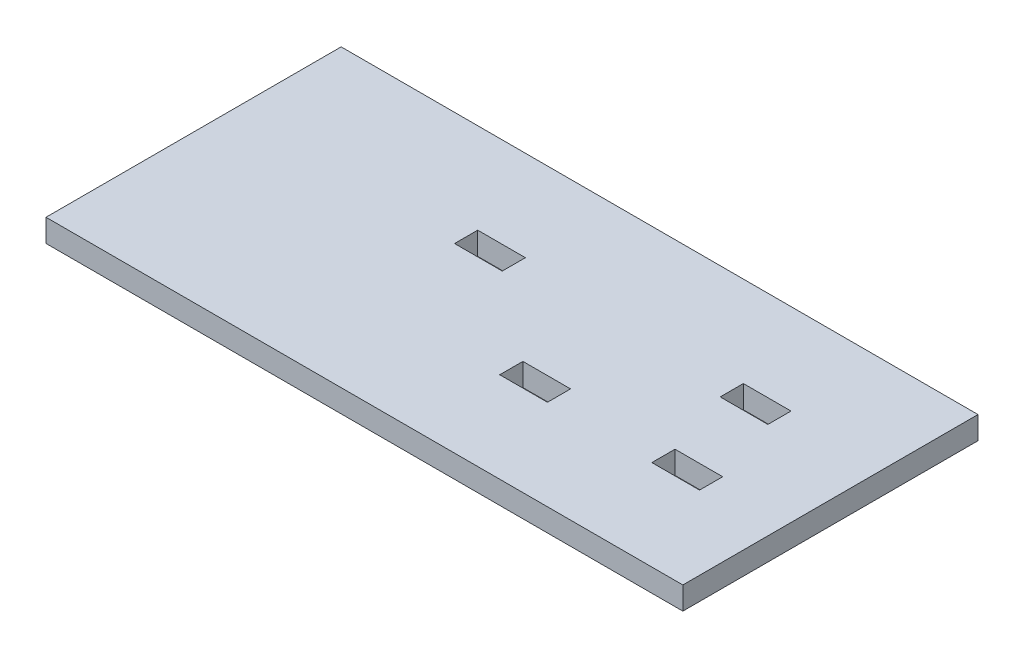
ISO-10303-21;
HEADER;
FILE_DESCRIPTION(('STEP AP214'),'2;1');
FILE_NAME('part.step','',(''),(''),'','','');
FILE_SCHEMA(('AUTOMOTIVE_DESIGN { 1 0 10303 214 1 1 1 1 }'));
ENDSEC;
DATA;
#1=APPLICATION_CONTEXT('core data for automotive mechanical design processes');
#2=APPLICATION_PROTOCOL_DEFINITION('international standard','automotive_design',2000,#1);
#3=PRODUCT_CONTEXT('',#1,'mechanical');
#4=PRODUCT('Part','Part','',(#3));
#5=PRODUCT_RELATED_PRODUCT_CATEGORY('part','',(#4));
#6=PRODUCT_DEFINITION_FORMATION('','',#4);
#7=PRODUCT_DEFINITION_CONTEXT('part definition',#1,'design');
#8=PRODUCT_DEFINITION('design','',#6,#7);
#9=PRODUCT_DEFINITION_SHAPE('','',#8);
#10=(LENGTH_UNIT() NAMED_UNIT(*) SI_UNIT(.MILLI.,.METRE.));
#11=(NAMED_UNIT(*) PLANE_ANGLE_UNIT() SI_UNIT($,.RADIAN.));
#12=(NAMED_UNIT(*) SI_UNIT($,.STERADIAN.) SOLID_ANGLE_UNIT());
#13=UNCERTAINTY_MEASURE_WITH_UNIT(LENGTH_MEASURE(1.E-05),#10,'distance_accuracy_value','');
#14=(GEOMETRIC_REPRESENTATION_CONTEXT(3) GLOBAL_UNCERTAINTY_ASSIGNED_CONTEXT((#13)) GLOBAL_UNIT_ASSIGNED_CONTEXT((#10,
#11,#12)) REPRESENTATION_CONTEXT('',''));
#15=CARTESIAN_POINT('',(0.,0.,0.));
#16=DIRECTION('',(0.,0.,1.));
#17=DIRECTION('',(1.,0.,0.));
#18=AXIS2_PLACEMENT_3D('',#15,#16,#17);
#19=CARTESIAN_POINT('',(70.125,-5.,32.5));
#20=DIRECTION('',(1.,0.,0.));
#21=DIRECTION('',(0.,0.,-1.));
#22=AXIS2_PLACEMENT_3D('',#19,#20,#21);
#23=PLANE('',#22);
#24=DIRECTION('',(0.,0.,-1.));
#25=VECTOR('',#24,1.);
#26=CARTESIAN_POINT('',(70.125,0.,32.5));
#27=LINE('',#26,#25);
#28=CARTESIAN_POINT('',(70.125,0.,32.5));
#29=VERTEX_POINT('',#28);
#30=CARTESIAN_POINT('',(70.125,0.,-32.5));
#31=VERTEX_POINT('',#30);
#32=EDGE_CURVE('E298',#29,#31,#27,.T.);
#33=ORIENTED_EDGE('',*,*,#32,.F.);
#34=DIRECTION('',(0.,1.,0.));
#35=VECTOR('',#34,1.);
#36=CARTESIAN_POINT('',(70.125,-5.,32.5));
#37=LINE('',#36,#35);
#38=CARTESIAN_POINT('',(70.125,-5.,32.5));
#39=VERTEX_POINT('',#38);
#40=EDGE_CURVE('E11',#39,#29,#37,.T.);
#41=ORIENTED_EDGE('',*,*,#40,.F.);
#42=DIRECTION('',(0.,0.,-1.));
#43=VECTOR('',#42,1.);
#44=CARTESIAN_POINT('',(70.125,-5.,32.5));
#45=LINE('',#44,#43);
#46=CARTESIAN_POINT('',(70.125,-5.,-32.5));
#47=VERTEX_POINT('',#46);
#48=EDGE_CURVE('E305',#39,#47,#45,.T.);
#49=ORIENTED_EDGE('',*,*,#48,.T.);
#50=DIRECTION('',(0.,1.,0.));
#51=VECTOR('',#50,1.);
#52=CARTESIAN_POINT('',(70.125,-5.,-32.5));
#53=LINE('',#52,#51);
#54=EDGE_CURVE('E38',#47,#31,#53,.T.);
#55=ORIENTED_EDGE('',*,*,#54,.T.);
#56=EDGE_LOOP('',(#33,#41,#49,#55));
#57=FACE_BOUND('',#56,.T.);
#58=ADVANCED_FACE('F35',(#57),#23,.T.);
#59=CARTESIAN_POINT('',(-70.125,-5.,32.5));
#60=DIRECTION('',(0.,0.,1.));
#61=DIRECTION('',(1.,0.,0.));
#62=AXIS2_PLACEMENT_3D('',#59,#60,#61);
#63=PLANE('',#62);
#64=DIRECTION('',(1.,0.,0.));
#65=VECTOR('',#64,1.);
#66=CARTESIAN_POINT('',(-70.125,0.,32.5));
#67=LINE('',#66,#65);
#68=CARTESIAN_POINT('',(-70.125,0.,32.5));
#69=VERTEX_POINT('',#68);
#70=EDGE_CURVE('E309',#69,#29,#67,.T.);
#71=ORIENTED_EDGE('',*,*,#70,.F.);
#72=DIRECTION('',(0.,1.,0.));
#73=VECTOR('',#72,1.);
#74=CARTESIAN_POINT('',(-70.125,-5.,32.5));
#75=LINE('',#74,#73);
#76=CARTESIAN_POINT('',(-70.125,-5.,32.5));
#77=VERTEX_POINT('',#76);
#78=EDGE_CURVE('E43',#77,#69,#75,.T.);
#79=ORIENTED_EDGE('',*,*,#78,.F.);
#80=DIRECTION('',(1.,0.,0.));
#81=VECTOR('',#80,1.);
#82=CARTESIAN_POINT('',(-70.125,-5.,32.5));
#83=LINE('',#82,#81);
#84=EDGE_CURVE('E315',#77,#39,#83,.T.);
#85=ORIENTED_EDGE('',*,*,#84,.T.);
#86=ORIENTED_EDGE('',*,*,#40,.T.);
#87=EDGE_LOOP('',(#71,#79,#85,#86));
#88=FACE_BOUND('',#87,.T.);
#89=ADVANCED_FACE('F341',(#88),#63,.T.);
#90=CARTESIAN_POINT('',(-70.125,-5.,32.5));
#91=DIRECTION('',(-1.,0.,0.));
#92=DIRECTION('',(0.,0.,1.));
#93=AXIS2_PLACEMENT_3D('',#90,#91,#92);
#94=PLANE('',#93);
#95=DIRECTION('',(0.,0.,1.));
#96=VECTOR('',#95,1.);
#97=CARTESIAN_POINT('',(-70.125,0.,32.5));
#98=LINE('',#97,#96);
#99=CARTESIAN_POINT('',(-70.125,0.,-32.5));
#100=VERTEX_POINT('',#99);
#101=EDGE_CURVE('E323',#100,#69,#98,.T.);
#102=ORIENTED_EDGE('',*,*,#101,.F.);
#103=DIRECTION('',(0.,1.,0.));
#104=VECTOR('',#103,1.);
#105=CARTESIAN_POINT('',(-70.125,-5.,-32.5));
#106=LINE('',#105,#104);
#107=CARTESIAN_POINT('',(-70.125,-5.,-32.5));
#108=VERTEX_POINT('',#107);
#109=EDGE_CURVE('E328',#108,#100,#106,.T.);
#110=ORIENTED_EDGE('',*,*,#109,.F.);
#111=DIRECTION('',(0.,0.,1.));
#112=VECTOR('',#111,1.);
#113=CARTESIAN_POINT('',(-70.125,-5.,32.5));
#114=LINE('',#113,#112);
#115=EDGE_CURVE('E312',#108,#77,#114,.T.);
#116=ORIENTED_EDGE('',*,*,#115,.T.);
#117=ORIENTED_EDGE('',*,*,#78,.T.);
#118=EDGE_LOOP('',(#102,#110,#116,#117));
#119=FACE_BOUND('',#118,.T.);
#120=ADVANCED_FACE('F346',(#119),#94,.T.);
#121=CARTESIAN_POINT('',(-70.125,-5.,-32.5));
#122=DIRECTION('',(0.,0.,-1.));
#123=DIRECTION('',(-1.,0.,0.));
#124=AXIS2_PLACEMENT_3D('',#121,#122,#123);
#125=PLANE('',#124);
#126=DIRECTION('',(-1.,0.,0.));
#127=VECTOR('',#126,1.);
#128=CARTESIAN_POINT('',(-70.125,0.,-32.5));
#129=LINE('',#128,#127);
#130=EDGE_CURVE('E320',#31,#100,#129,.T.);
#131=ORIENTED_EDGE('',*,*,#130,.F.);
#132=ORIENTED_EDGE('',*,*,#54,.F.);
#133=DIRECTION('',(-1.,0.,0.));
#134=VECTOR('',#133,1.);
#135=CARTESIAN_POINT('',(-70.125,-5.,-32.5));
#136=LINE('',#135,#134);
#137=EDGE_CURVE('E308',#47,#108,#136,.T.);
#138=ORIENTED_EDGE('',*,*,#137,.T.);
#139=ORIENTED_EDGE('',*,*,#109,.T.);
#140=EDGE_LOOP('',(#131,#132,#138,#139));
#141=FACE_BOUND('',#140,.T.);
#142=ADVANCED_FACE('F336',(#141),#125,.T.);
#143=CARTESIAN_POINT('',(0.,-5.,0.));
#144=DIRECTION('',(0.,-1.,0.));
#145=DIRECTION('',(0.,0.,-1.));
#146=AXIS2_PLACEMENT_3D('',#143,#144,#145);
#147=PLANE('',#146);
#148=DIRECTION('',(0.,0.,1.));
#149=VECTOR('',#148,1.);
#150=CARTESIAN_POINT('',(43.375,-5.,12.575));
#151=LINE('',#150,#149);
#152=CARTESIAN_POINT('',(43.375,-5.,7.47500000000001));
#153=VERTEX_POINT('',#152);
#154=CARTESIAN_POINT('',(43.375,-5.,12.575));
#155=VERTEX_POINT('',#154);
#156=EDGE_CURVE('E174',#153,#155,#151,.T.);
#157=ORIENTED_EDGE('',*,*,#156,.T.);
#158=DIRECTION('',(1.,0.,0.));
#159=VECTOR('',#158,1.);
#160=CARTESIAN_POINT('',(43.375,-5.,12.575));
#161=LINE('',#160,#159);
#162=CARTESIAN_POINT('',(53.875,-5.,12.575));
#163=VERTEX_POINT('',#162);
#164=EDGE_CURVE('E183',#155,#163,#161,.T.);
#165=ORIENTED_EDGE('',*,*,#164,.T.);
#166=DIRECTION('',(0.,0.,-1.));
#167=VECTOR('',#166,1.);
#168=CARTESIAN_POINT('',(53.875,-5.,12.575));
#169=LINE('',#168,#167);
#170=CARTESIAN_POINT('',(53.875,-5.,7.47500000000002));
#171=VERTEX_POINT('',#170);
#172=EDGE_CURVE('E51',#163,#171,#169,.T.);
#173=ORIENTED_EDGE('',*,*,#172,.T.);
#174=DIRECTION('',(-1.,0.,0.));
#175=VECTOR('',#174,1.);
#176=CARTESIAN_POINT('',(43.375,-5.,7.47500000000001));
#177=LINE('',#176,#175);
#178=EDGE_CURVE('E180',#171,#153,#177,.T.);
#179=ORIENTED_EDGE('',*,*,#178,.T.);
#180=EDGE_LOOP('',(#157,#165,#173,#179));
#181=FACE_BOUND('',#180,.T.);
#182=DIRECTION('',(0.,0.,1.));
#183=VECTOR('',#182,1.);
#184=CARTESIAN_POINT('',(9.87499999999999,-5.,12.575));
#185=LINE('',#184,#183);
#186=CARTESIAN_POINT('',(9.87499999999999,-5.,7.47500000000001));
#187=VERTEX_POINT('',#186);
#188=CARTESIAN_POINT('',(9.87499999999999,-5.,12.575));
#189=VERTEX_POINT('',#188);
#190=EDGE_CURVE('E209',#187,#189,#185,.T.);
#191=ORIENTED_EDGE('',*,*,#190,.T.);
#192=DIRECTION('',(1.,0.,0.));
#193=VECTOR('',#192,1.);
#194=CARTESIAN_POINT('',(9.87499999999999,-5.,12.575));
#195=LINE('',#194,#193);
#196=CARTESIAN_POINT('',(20.375,-5.,12.575));
#197=VERTEX_POINT('',#196);
#198=EDGE_CURVE('E212',#189,#197,#195,.T.);
#199=ORIENTED_EDGE('',*,*,#198,.T.);
#200=DIRECTION('',(0.,0.,-1.));
#201=VECTOR('',#200,1.);
#202=CARTESIAN_POINT('',(20.375,-5.,12.575));
#203=LINE('',#202,#201);
#204=CARTESIAN_POINT('',(20.375,-5.,7.47500000000001));
#205=VERTEX_POINT('',#204);
#206=EDGE_CURVE('E216',#197,#205,#203,.T.);
#207=ORIENTED_EDGE('',*,*,#206,.T.);
#208=DIRECTION('',(-1.,0.,0.));
#209=VECTOR('',#208,1.);
#210=CARTESIAN_POINT('',(9.87499999999999,-5.,7.47500000000001));
#211=LINE('',#210,#209);
#212=EDGE_CURVE('E219',#205,#187,#211,.T.);
#213=ORIENTED_EDGE('',*,*,#212,.T.);
#214=EDGE_LOOP('',(#191,#199,#207,#213));
#215=FACE_BOUND('',#214,.T.);
#216=DIRECTION('',(0.,0.,1.));
#217=VECTOR('',#216,1.);
#218=CARTESIAN_POINT('',(-20.125,-5.,-7.47499999999998));
#219=LINE('',#218,#217);
#220=CARTESIAN_POINT('',(-20.125,-5.,-12.575));
#221=VERTEX_POINT('',#220);
#222=CARTESIAN_POINT('',(-20.125,-5.,-7.47499999999998));
#223=VERTEX_POINT('',#222);
#224=EDGE_CURVE('E241',#221,#223,#219,.T.);
#225=ORIENTED_EDGE('',*,*,#224,.T.);
#226=DIRECTION('',(1.,0.,0.));
#227=VECTOR('',#226,1.);
#228=CARTESIAN_POINT('',(-20.125,-5.,-7.47499999999998));
#229=LINE('',#228,#227);
#230=CARTESIAN_POINT('',(-9.62500000000002,-5.,-7.47499999999999));
#231=VERTEX_POINT('',#230);
#232=EDGE_CURVE('E244',#223,#231,#229,.T.);
#233=ORIENTED_EDGE('',*,*,#232,.T.);
#234=DIRECTION('',(0.,0.,-1.));
#235=VECTOR('',#234,1.);
#236=CARTESIAN_POINT('',(-9.62500000000002,-5.,-7.47499999999999));
#237=LINE('',#236,#235);
#238=CARTESIAN_POINT('',(-9.62500000000002,-5.,-12.575));
#239=VERTEX_POINT('',#238);
#240=EDGE_CURVE('E248',#231,#239,#237,.T.);
#241=ORIENTED_EDGE('',*,*,#240,.T.);
#242=DIRECTION('',(-1.,0.,0.));
#243=VECTOR('',#242,1.);
#244=CARTESIAN_POINT('',(-20.125,-5.,-12.575));
#245=LINE('',#244,#243);
#246=EDGE_CURVE('E251',#239,#221,#245,.T.);
#247=ORIENTED_EDGE('',*,*,#246,.T.);
#248=EDGE_LOOP('',(#225,#233,#241,#247));
#249=FACE_BOUND('',#248,.T.);
#250=DIRECTION('',(0.,0.,1.));
#251=VECTOR('',#250,1.);
#252=CARTESIAN_POINT('',(38.375,-5.,-7.47499999999998));
#253=LINE('',#252,#251);
#254=CARTESIAN_POINT('',(38.375,-5.,-12.575));
#255=VERTEX_POINT('',#254);
#256=CARTESIAN_POINT('',(38.375,-5.,-7.47499999999998));
#257=VERTEX_POINT('',#256);
#258=EDGE_CURVE('E273',#255,#257,#253,.T.);
#259=ORIENTED_EDGE('',*,*,#258,.T.);
#260=DIRECTION('',(1.,0.,0.));
#261=VECTOR('',#260,1.);
#262=CARTESIAN_POINT('',(38.375,-5.,-7.47499999999998));
#263=LINE('',#262,#261);
#264=CARTESIAN_POINT('',(48.875,-5.,-7.47499999999999));
#265=VERTEX_POINT('',#264);
#266=EDGE_CURVE('E276',#257,#265,#263,.T.);
#267=ORIENTED_EDGE('',*,*,#266,.T.);
#268=DIRECTION('',(0.,0.,-1.));
#269=VECTOR('',#268,1.);
#270=CARTESIAN_POINT('',(48.875,-5.,-7.47499999999999));
#271=LINE('',#270,#269);
#272=CARTESIAN_POINT('',(48.875,-5.,-12.575));
#273=VERTEX_POINT('',#272);
#274=EDGE_CURVE('E280',#265,#273,#271,.T.);
#275=ORIENTED_EDGE('',*,*,#274,.T.);
#276=DIRECTION('',(-1.,0.,0.));
#277=VECTOR('',#276,1.);
#278=CARTESIAN_POINT('',(38.375,-5.,-12.575));
#279=LINE('',#278,#277);
#280=EDGE_CURVE('E283',#273,#255,#279,.T.);
#281=ORIENTED_EDGE('',*,*,#280,.T.);
#282=EDGE_LOOP('',(#259,#267,#275,#281));
#283=FACE_BOUND('',#282,.T.);
#284=ORIENTED_EDGE('',*,*,#48,.F.);
#285=ORIENTED_EDGE('',*,*,#84,.F.);
#286=ORIENTED_EDGE('',*,*,#115,.F.);
#287=ORIENTED_EDGE('',*,*,#137,.F.);
#288=EDGE_LOOP('',(#284,#285,#286,#287));
#289=FACE_BOUND('',#288,.T.);
#290=ADVANCED_FACE('F187',(#181,#215,#249,#283,#289),#147,.T.);
#291=CARTESIAN_POINT('',(0.,0.,0.));
#292=DIRECTION('',(0.,-1.,0.));
#293=DIRECTION('',(0.,0.,-1.));
#294=AXIS2_PLACEMENT_3D('',#291,#292,#293);
#295=PLANE('',#294);
#296=DIRECTION('',(1.,0.,0.));
#297=VECTOR('',#296,1.);
#298=CARTESIAN_POINT('',(43.375,0.,12.575));
#299=LINE('',#298,#297);
#300=CARTESIAN_POINT('',(43.375,0.,12.575));
#301=VERTEX_POINT('',#300);
#302=CARTESIAN_POINT('',(53.875,0.,12.575));
#303=VERTEX_POINT('',#302);
#304=EDGE_CURVE('E199',#301,#303,#299,.T.);
#305=ORIENTED_EDGE('',*,*,#304,.F.);
#306=DIRECTION('',(0.,0.,1.));
#307=VECTOR('',#306,1.);
#308=CARTESIAN_POINT('',(43.375,0.,12.575));
#309=LINE('',#308,#307);
#310=CARTESIAN_POINT('',(43.375,0.,7.47500000000001));
#311=VERTEX_POINT('',#310);
#312=EDGE_CURVE('E59',#311,#301,#309,.T.);
#313=ORIENTED_EDGE('',*,*,#312,.F.);
#314=DIRECTION('',(-1.,0.,0.));
#315=VECTOR('',#314,1.);
#316=CARTESIAN_POINT('',(43.375,0.,7.47500000000001));
#317=LINE('',#316,#315);
#318=CARTESIAN_POINT('',(53.875,0.,7.47500000000002));
#319=VERTEX_POINT('',#318);
#320=EDGE_CURVE('E190',#319,#311,#317,.T.);
#321=ORIENTED_EDGE('',*,*,#320,.F.);
#322=DIRECTION('',(0.,0.,-1.));
#323=VECTOR('',#322,1.);
#324=CARTESIAN_POINT('',(53.875,0.,12.575));
#325=LINE('',#324,#323);
#326=EDGE_CURVE('E193',#303,#319,#325,.T.);
#327=ORIENTED_EDGE('',*,*,#326,.F.);
#328=EDGE_LOOP('',(#305,#313,#321,#327));
#329=FACE_BOUND('',#328,.T.);
#330=DIRECTION('',(1.,0.,0.));
#331=VECTOR('',#330,1.);
#332=CARTESIAN_POINT('',(9.87499999999999,0.,12.575));
#333=LINE('',#332,#331);
#334=CARTESIAN_POINT('',(9.87499999999999,0.,12.575));
#335=VERTEX_POINT('',#334);
#336=CARTESIAN_POINT('',(20.375,0.,12.575));
#337=VERTEX_POINT('',#336);
#338=EDGE_CURVE('E224',#335,#337,#333,.T.);
#339=ORIENTED_EDGE('',*,*,#338,.F.);
#340=DIRECTION('',(0.,0.,1.));
#341=VECTOR('',#340,1.);
#342=CARTESIAN_POINT('',(9.87499999999999,0.,12.575));
#343=LINE('',#342,#341);
#344=CARTESIAN_POINT('',(9.87499999999999,0.,7.47500000000001));
#345=VERTEX_POINT('',#344);
#346=EDGE_CURVE('E205',#345,#335,#343,.T.);
#347=ORIENTED_EDGE('',*,*,#346,.F.);
#348=DIRECTION('',(-1.,0.,0.));
#349=VECTOR('',#348,1.);
#350=CARTESIAN_POINT('',(9.87499999999999,0.,7.47500000000001));
#351=LINE('',#350,#349);
#352=CARTESIAN_POINT('',(20.375,0.,7.47500000000001));
#353=VERTEX_POINT('',#352);
#354=EDGE_CURVE('E213',#353,#345,#351,.T.);
#355=ORIENTED_EDGE('',*,*,#354,.F.);
#356=DIRECTION('',(0.,0.,-1.));
#357=VECTOR('',#356,1.);
#358=CARTESIAN_POINT('',(20.375,0.,12.575));
#359=LINE('',#358,#357);
#360=EDGE_CURVE('E227',#337,#353,#359,.T.);
#361=ORIENTED_EDGE('',*,*,#360,.F.);
#362=EDGE_LOOP('',(#339,#347,#355,#361));
#363=FACE_BOUND('',#362,.T.);
#364=DIRECTION('',(1.,0.,0.));
#365=VECTOR('',#364,1.);
#366=CARTESIAN_POINT('',(-20.125,0.,-7.47499999999998));
#367=LINE('',#366,#365);
#368=CARTESIAN_POINT('',(-20.125,0.,-7.47499999999998));
#369=VERTEX_POINT('',#368);
#370=CARTESIAN_POINT('',(-9.62500000000002,0.,-7.47499999999999));
#371=VERTEX_POINT('',#370);
#372=EDGE_CURVE('E256',#369,#371,#367,.T.);
#373=ORIENTED_EDGE('',*,*,#372,.F.);
#374=DIRECTION('',(0.,0.,1.));
#375=VECTOR('',#374,1.);
#376=CARTESIAN_POINT('',(-20.125,0.,-7.47499999999998));
#377=LINE('',#376,#375);
#378=CARTESIAN_POINT('',(-20.125,0.,-12.575));
#379=VERTEX_POINT('',#378);
#380=EDGE_CURVE('E234',#379,#369,#377,.T.);
#381=ORIENTED_EDGE('',*,*,#380,.F.);
#382=DIRECTION('',(-1.,0.,0.));
#383=VECTOR('',#382,1.);
#384=CARTESIAN_POINT('',(-20.125,0.,-12.575));
#385=LINE('',#384,#383);
#386=CARTESIAN_POINT('',(-9.62500000000002,0.,-12.575));
#387=VERTEX_POINT('',#386);
#388=EDGE_CURVE('E245',#387,#379,#385,.T.);
#389=ORIENTED_EDGE('',*,*,#388,.F.);
#390=DIRECTION('',(0.,0.,-1.));
#391=VECTOR('',#390,1.);
#392=CARTESIAN_POINT('',(-9.62500000000002,0.,-7.47499999999999));
#393=LINE('',#392,#391);
#394=EDGE_CURVE('E259',#371,#387,#393,.T.);
#395=ORIENTED_EDGE('',*,*,#394,.F.);
#396=EDGE_LOOP('',(#373,#381,#389,#395));
#397=FACE_BOUND('',#396,.T.);
#398=DIRECTION('',(1.,0.,0.));
#399=VECTOR('',#398,1.);
#400=CARTESIAN_POINT('',(38.375,0.,-7.47499999999998));
#401=LINE('',#400,#399);
#402=CARTESIAN_POINT('',(38.375,0.,-7.47499999999998));
#403=VERTEX_POINT('',#402);
#404=CARTESIAN_POINT('',(48.875,0.,-7.47499999999999));
#405=VERTEX_POINT('',#404);
#406=EDGE_CURVE('E288',#403,#405,#401,.T.);
#407=ORIENTED_EDGE('',*,*,#406,.F.);
#408=DIRECTION('',(0.,0.,1.));
#409=VECTOR('',#408,1.);
#410=CARTESIAN_POINT('',(38.375,0.,-7.47499999999998));
#411=LINE('',#410,#409);
#412=CARTESIAN_POINT('',(38.375,0.,-12.575));
#413=VERTEX_POINT('',#412);
#414=EDGE_CURVE('E266',#413,#403,#411,.T.);
#415=ORIENTED_EDGE('',*,*,#414,.F.);
#416=DIRECTION('',(-1.,0.,0.));
#417=VECTOR('',#416,1.);
#418=CARTESIAN_POINT('',(38.375,0.,-12.575));
#419=LINE('',#418,#417);
#420=CARTESIAN_POINT('',(48.875,0.,-12.575));
#421=VERTEX_POINT('',#420);
#422=EDGE_CURVE('E277',#421,#413,#419,.T.);
#423=ORIENTED_EDGE('',*,*,#422,.F.);
#424=DIRECTION('',(0.,0.,-1.));
#425=VECTOR('',#424,1.);
#426=CARTESIAN_POINT('',(48.875,0.,-7.47499999999999));
#427=LINE('',#426,#425);
#428=EDGE_CURVE('E291',#405,#421,#427,.T.);
#429=ORIENTED_EDGE('',*,*,#428,.F.);
#430=EDGE_LOOP('',(#407,#415,#423,#429));
#431=FACE_BOUND('',#430,.T.);
#432=ORIENTED_EDGE('',*,*,#32,.T.);
#433=ORIENTED_EDGE('',*,*,#130,.T.);
#434=ORIENTED_EDGE('',*,*,#101,.T.);
#435=ORIENTED_EDGE('',*,*,#70,.T.);
#436=EDGE_LOOP('',(#432,#433,#434,#435));
#437=FACE_BOUND('',#436,.T.);
#438=ADVANCED_FACE('F338',(#329,#363,#397,#431,#437),#295,.F.);
#439=CARTESIAN_POINT('',(38.375,-5.,-7.47499999999998));
#440=DIRECTION('',(-1.,0.,0.));
#441=DIRECTION('',(0.,0.,1.));
#442=AXIS2_PLACEMENT_3D('',#439,#440,#441);
#443=PLANE('',#442);
#444=ORIENTED_EDGE('',*,*,#414,.T.);
#445=DIRECTION('',(0.,1.,0.));
#446=VECTOR('',#445,1.);
#447=CARTESIAN_POINT('',(38.375,-5.,-7.47499999999998));
#448=LINE('',#447,#446);
#449=EDGE_CURVE('E286',#257,#403,#448,.T.);
#450=ORIENTED_EDGE('',*,*,#449,.F.);
#451=ORIENTED_EDGE('',*,*,#258,.F.);
#452=DIRECTION('',(0.,1.,0.));
#453=VECTOR('',#452,1.);
#454=CARTESIAN_POINT('',(38.375,-5.,-12.575));
#455=LINE('',#454,#453);
#456=EDGE_CURVE('E296',#255,#413,#455,.T.);
#457=ORIENTED_EDGE('',*,*,#456,.T.);
#458=EDGE_LOOP('',(#444,#450,#451,#457));
#459=FACE_BOUND('',#458,.T.);
#460=ADVANCED_FACE('F392',(#459),#443,.F.);
#461=CARTESIAN_POINT('',(38.375,-5.,-12.575));
#462=DIRECTION('',(0.,0.,-1.));
#463=DIRECTION('',(-1.,0.,0.));
#464=AXIS2_PLACEMENT_3D('',#461,#462,#463);
#465=PLANE('',#464);
#466=ORIENTED_EDGE('',*,*,#422,.T.);
#467=ORIENTED_EDGE('',*,*,#456,.F.);
#468=ORIENTED_EDGE('',*,*,#280,.F.);
#469=DIRECTION('',(0.,1.,0.));
#470=VECTOR('',#469,1.);
#471=CARTESIAN_POINT('',(48.875,-5.,-12.575));
#472=LINE('',#471,#470);
#473=EDGE_CURVE('E299',#273,#421,#472,.T.);
#474=ORIENTED_EDGE('',*,*,#473,.T.);
#475=EDGE_LOOP('',(#466,#467,#468,#474));
#476=FACE_BOUND('',#475,.T.);
#477=ADVANCED_FACE('F403',(#476),#465,.F.);
#478=CARTESIAN_POINT('',(48.875,-5.,-7.47499999999999));
#479=DIRECTION('',(1.,0.,0.));
#480=DIRECTION('',(0.,0.,-1.));
#481=AXIS2_PLACEMENT_3D('',#478,#479,#480);
#482=PLANE('',#481);
#483=ORIENTED_EDGE('',*,*,#428,.T.);
#484=ORIENTED_EDGE('',*,*,#473,.F.);
#485=ORIENTED_EDGE('',*,*,#274,.F.);
#486=DIRECTION('',(0.,1.,0.));
#487=VECTOR('',#486,1.);
#488=CARTESIAN_POINT('',(48.875,-5.,-7.47499999999999));
#489=LINE('',#488,#487);
#490=EDGE_CURVE('E301',#265,#405,#489,.T.);
#491=ORIENTED_EDGE('',*,*,#490,.T.);
#492=EDGE_LOOP('',(#483,#484,#485,#491));
#493=FACE_BOUND('',#492,.T.);
#494=ADVANCED_FACE('F414',(#493),#482,.F.);
#495=CARTESIAN_POINT('',(38.375,-5.,-7.47499999999998));
#496=DIRECTION('',(0.,0.,1.));
#497=DIRECTION('',(1.,0.,0.));
#498=AXIS2_PLACEMENT_3D('',#495,#496,#497);
#499=PLANE('',#498);
#500=ORIENTED_EDGE('',*,*,#406,.T.);
#501=ORIENTED_EDGE('',*,*,#490,.F.);
#502=ORIENTED_EDGE('',*,*,#266,.F.);
#503=ORIENTED_EDGE('',*,*,#449,.T.);
#504=EDGE_LOOP('',(#500,#501,#502,#503));
#505=FACE_BOUND('',#504,.T.);
#506=ADVANCED_FACE('F425',(#505),#499,.F.);
#507=CARTESIAN_POINT('',(-20.125,-5.,-7.47499999999998));
#508=DIRECTION('',(-1.,0.,0.));
#509=DIRECTION('',(0.,0.,1.));
#510=AXIS2_PLACEMENT_3D('',#507,#508,#509);
#511=PLANE('',#510);
#512=ORIENTED_EDGE('',*,*,#380,.T.);
#513=DIRECTION('',(0.,1.,0.));
#514=VECTOR('',#513,1.);
#515=CARTESIAN_POINT('',(-20.125,-5.,-7.47499999999998));
#516=LINE('',#515,#514);
#517=EDGE_CURVE('E254',#223,#369,#516,.T.);
#518=ORIENTED_EDGE('',*,*,#517,.F.);
#519=ORIENTED_EDGE('',*,*,#224,.F.);
#520=DIRECTION('',(0.,1.,0.));
#521=VECTOR('',#520,1.);
#522=CARTESIAN_POINT('',(-20.125,-5.,-12.575));
#523=LINE('',#522,#521);
#524=EDGE_CURVE('E264',#221,#379,#523,.T.);
#525=ORIENTED_EDGE('',*,*,#524,.T.);
#526=EDGE_LOOP('',(#512,#518,#519,#525));
#527=FACE_BOUND('',#526,.T.);
#528=ADVANCED_FACE('F436',(#527),#511,.F.);
#529=CARTESIAN_POINT('',(-20.125,-5.,-12.575));
#530=DIRECTION('',(0.,0.,-1.));
#531=DIRECTION('',(-1.,0.,0.));
#532=AXIS2_PLACEMENT_3D('',#529,#530,#531);
#533=PLANE('',#532);
#534=ORIENTED_EDGE('',*,*,#388,.T.);
#535=ORIENTED_EDGE('',*,*,#524,.F.);
#536=ORIENTED_EDGE('',*,*,#246,.F.);
#537=DIRECTION('',(0.,1.,0.));
#538=VECTOR('',#537,1.);
#539=CARTESIAN_POINT('',(-9.62500000000002,-5.,-12.575));
#540=LINE('',#539,#538);
#541=EDGE_CURVE('E267',#239,#387,#540,.T.);
#542=ORIENTED_EDGE('',*,*,#541,.T.);
#543=EDGE_LOOP('',(#534,#535,#536,#542));
#544=FACE_BOUND('',#543,.T.);
#545=ADVANCED_FACE('F447',(#544),#533,.F.);
#546=CARTESIAN_POINT('',(-9.62500000000002,-5.,-7.47499999999999));
#547=DIRECTION('',(1.,0.,0.));
#548=DIRECTION('',(0.,0.,-1.));
#549=AXIS2_PLACEMENT_3D('',#546,#547,#548);
#550=PLANE('',#549);
#551=ORIENTED_EDGE('',*,*,#394,.T.);
#552=ORIENTED_EDGE('',*,*,#541,.F.);
#553=ORIENTED_EDGE('',*,*,#240,.F.);
#554=DIRECTION('',(0.,1.,0.));
#555=VECTOR('',#554,1.);
#556=CARTESIAN_POINT('',(-9.62500000000002,-5.,-7.47499999999999));
#557=LINE('',#556,#555);
#558=EDGE_CURVE('E269',#231,#371,#557,.T.);
#559=ORIENTED_EDGE('',*,*,#558,.T.);
#560=EDGE_LOOP('',(#551,#552,#553,#559));
#561=FACE_BOUND('',#560,.T.);
#562=ADVANCED_FACE('F458',(#561),#550,.F.);
#563=CARTESIAN_POINT('',(-20.125,-5.,-7.47499999999998));
#564=DIRECTION('',(0.,0.,1.));
#565=DIRECTION('',(1.,0.,0.));
#566=AXIS2_PLACEMENT_3D('',#563,#564,#565);
#567=PLANE('',#566);
#568=ORIENTED_EDGE('',*,*,#372,.T.);
#569=ORIENTED_EDGE('',*,*,#558,.F.);
#570=ORIENTED_EDGE('',*,*,#232,.F.);
#571=ORIENTED_EDGE('',*,*,#517,.T.);
#572=EDGE_LOOP('',(#568,#569,#570,#571));
#573=FACE_BOUND('',#572,.T.);
#574=ADVANCED_FACE('F469',(#573),#567,.F.);
#575=CARTESIAN_POINT('',(9.87499999999999,-5.,12.575));
#576=DIRECTION('',(-1.,0.,0.));
#577=DIRECTION('',(0.,0.,1.));
#578=AXIS2_PLACEMENT_3D('',#575,#576,#577);
#579=PLANE('',#578);
#580=ORIENTED_EDGE('',*,*,#346,.T.);
#581=DIRECTION('',(0.,1.,0.));
#582=VECTOR('',#581,1.);
#583=CARTESIAN_POINT('',(9.87499999999999,-5.,12.575));
#584=LINE('',#583,#582);
#585=EDGE_CURVE('E222',#189,#335,#584,.T.);
#586=ORIENTED_EDGE('',*,*,#585,.F.);
#587=ORIENTED_EDGE('',*,*,#190,.F.);
#588=DIRECTION('',(0.,1.,0.));
#589=VECTOR('',#588,1.);
#590=CARTESIAN_POINT('',(9.87499999999999,-5.,7.47500000000001));
#591=LINE('',#590,#589);
#592=EDGE_CURVE('E232',#187,#345,#591,.T.);
#593=ORIENTED_EDGE('',*,*,#592,.T.);
#594=EDGE_LOOP('',(#580,#586,#587,#593));
#595=FACE_BOUND('',#594,.T.);
#596=ADVANCED_FACE('F480',(#595),#579,.F.);
#597=CARTESIAN_POINT('',(9.87499999999999,-5.,7.47500000000001));
#598=DIRECTION('',(0.,0.,-1.));
#599=DIRECTION('',(-1.,0.,0.));
#600=AXIS2_PLACEMENT_3D('',#597,#598,#599);
#601=PLANE('',#600);
#602=ORIENTED_EDGE('',*,*,#354,.T.);
#603=ORIENTED_EDGE('',*,*,#592,.F.);
#604=ORIENTED_EDGE('',*,*,#212,.F.);
#605=DIRECTION('',(0.,1.,0.));
#606=VECTOR('',#605,1.);
#607=CARTESIAN_POINT('',(20.375,-5.,7.47500000000001));
#608=LINE('',#607,#606);
#609=EDGE_CURVE('E235',#205,#353,#608,.T.);
#610=ORIENTED_EDGE('',*,*,#609,.T.);
#611=EDGE_LOOP('',(#602,#603,#604,#610));
#612=FACE_BOUND('',#611,.T.);
#613=ADVANCED_FACE('F491',(#612),#601,.F.);
#614=CARTESIAN_POINT('',(20.375,-5.,12.575));
#615=DIRECTION('',(1.,0.,0.));
#616=DIRECTION('',(0.,0.,-1.));
#617=AXIS2_PLACEMENT_3D('',#614,#615,#616);
#618=PLANE('',#617);
#619=ORIENTED_EDGE('',*,*,#360,.T.);
#620=ORIENTED_EDGE('',*,*,#609,.F.);
#621=ORIENTED_EDGE('',*,*,#206,.F.);
#622=DIRECTION('',(0.,1.,0.));
#623=VECTOR('',#622,1.);
#624=CARTESIAN_POINT('',(20.375,-5.,12.575));
#625=LINE('',#624,#623);
#626=EDGE_CURVE('E237',#197,#337,#625,.T.);
#627=ORIENTED_EDGE('',*,*,#626,.T.);
#628=EDGE_LOOP('',(#619,#620,#621,#627));
#629=FACE_BOUND('',#628,.T.);
#630=ADVANCED_FACE('F502',(#629),#618,.F.);
#631=CARTESIAN_POINT('',(9.87499999999999,-5.,12.575));
#632=DIRECTION('',(0.,0.,1.));
#633=DIRECTION('',(1.,0.,0.));
#634=AXIS2_PLACEMENT_3D('',#631,#632,#633);
#635=PLANE('',#634);
#636=ORIENTED_EDGE('',*,*,#338,.T.);
#637=ORIENTED_EDGE('',*,*,#626,.F.);
#638=ORIENTED_EDGE('',*,*,#198,.F.);
#639=ORIENTED_EDGE('',*,*,#585,.T.);
#640=EDGE_LOOP('',(#636,#637,#638,#639));
#641=FACE_BOUND('',#640,.T.);
#642=ADVANCED_FACE('F513',(#641),#635,.F.);
#643=CARTESIAN_POINT('',(43.375,-5.,12.575));
#644=DIRECTION('',(-1.,0.,0.));
#645=DIRECTION('',(0.,0.,1.));
#646=AXIS2_PLACEMENT_3D('',#643,#644,#645);
#647=PLANE('',#646);
#648=ORIENTED_EDGE('',*,*,#312,.T.);
#649=DIRECTION('',(0.,1.,0.));
#650=VECTOR('',#649,1.);
#651=CARTESIAN_POINT('',(43.375,-5.,12.575));
#652=LINE('',#651,#650);
#653=EDGE_CURVE('E170',#155,#301,#652,.T.);
#654=ORIENTED_EDGE('',*,*,#653,.F.);
#655=ORIENTED_EDGE('',*,*,#156,.F.);
#656=DIRECTION('',(0.,1.,0.));
#657=VECTOR('',#656,1.);
#658=CARTESIAN_POINT('',(43.375,-5.,7.47500000000001));
#659=LINE('',#658,#657);
#660=EDGE_CURVE('E203',#153,#311,#659,.T.);
#661=ORIENTED_EDGE('',*,*,#660,.T.);
#662=EDGE_LOOP('',(#648,#654,#655,#661));
#663=FACE_BOUND('',#662,.T.);
#664=ADVANCED_FACE('F172',(#663),#647,.F.);
#665=CARTESIAN_POINT('',(43.375,-5.,7.47500000000001));
#666=DIRECTION('',(0.,0.,-1.));
#667=DIRECTION('',(-1.,0.,0.));
#668=AXIS2_PLACEMENT_3D('',#665,#666,#667);
#669=PLANE('',#668);
#670=ORIENTED_EDGE('',*,*,#320,.T.);
#671=ORIENTED_EDGE('',*,*,#660,.F.);
#672=ORIENTED_EDGE('',*,*,#178,.F.);
#673=DIRECTION('',(0.,1.,0.));
#674=VECTOR('',#673,1.);
#675=CARTESIAN_POINT('',(53.875,-5.,7.47500000000002));
#676=LINE('',#675,#674);
#677=EDGE_CURVE('E206',#171,#319,#676,.T.);
#678=ORIENTED_EDGE('',*,*,#677,.T.);
#679=EDGE_LOOP('',(#670,#671,#672,#678));
#680=FACE_BOUND('',#679,.T.);
#681=ADVANCED_FACE('F534',(#680),#669,.F.);
#682=CARTESIAN_POINT('',(53.875,-5.,12.575));
#683=DIRECTION('',(1.,0.,0.));
#684=DIRECTION('',(0.,0.,-1.));
#685=AXIS2_PLACEMENT_3D('',#682,#683,#684);
#686=PLANE('',#685);
#687=ORIENTED_EDGE('',*,*,#326,.T.);
#688=ORIENTED_EDGE('',*,*,#677,.F.);
#689=ORIENTED_EDGE('',*,*,#172,.F.);
#690=DIRECTION('',(0.,1.,0.));
#691=VECTOR('',#690,1.);
#692=CARTESIAN_POINT('',(53.875,-5.,12.575));
#693=LINE('',#692,#691);
#694=EDGE_CURVE('E179',#163,#303,#693,.T.);
#695=ORIENTED_EDGE('',*,*,#694,.T.);
#696=EDGE_LOOP('',(#687,#688,#689,#695));
#697=FACE_BOUND('',#696,.T.);
#698=ADVANCED_FACE('F544',(#697),#686,.F.);
#699=CARTESIAN_POINT('',(43.375,-5.,12.575));
#700=DIRECTION('',(0.,0.,1.));
#701=DIRECTION('',(1.,0.,0.));
#702=AXIS2_PLACEMENT_3D('',#699,#700,#701);
#703=PLANE('',#702);
#704=ORIENTED_EDGE('',*,*,#304,.T.);
#705=ORIENTED_EDGE('',*,*,#694,.F.);
#706=ORIENTED_EDGE('',*,*,#164,.F.);
#707=ORIENTED_EDGE('',*,*,#653,.T.);
#708=EDGE_LOOP('',(#704,#705,#706,#707));
#709=FACE_BOUND('',#708,.T.);
#710=ADVANCED_FACE('F184',(#709),#703,.F.);
#711=CLOSED_SHELL('',(#58,#89,#120,#142,#290,#438,#460,#477,#494,#506,#528,#545,#562,#574,#596,
#613,#630,#642,#664,#681,#698,#710));
#712=MANIFOLD_SOLID_BREP('B2',#711);
#713=ADVANCED_BREP_SHAPE_REPRESENTATION('',(#18,#712),#14);
#714=SHAPE_DEFINITION_REPRESENTATION(#9,#713);
ENDSEC;
END-ISO-10303-21;
